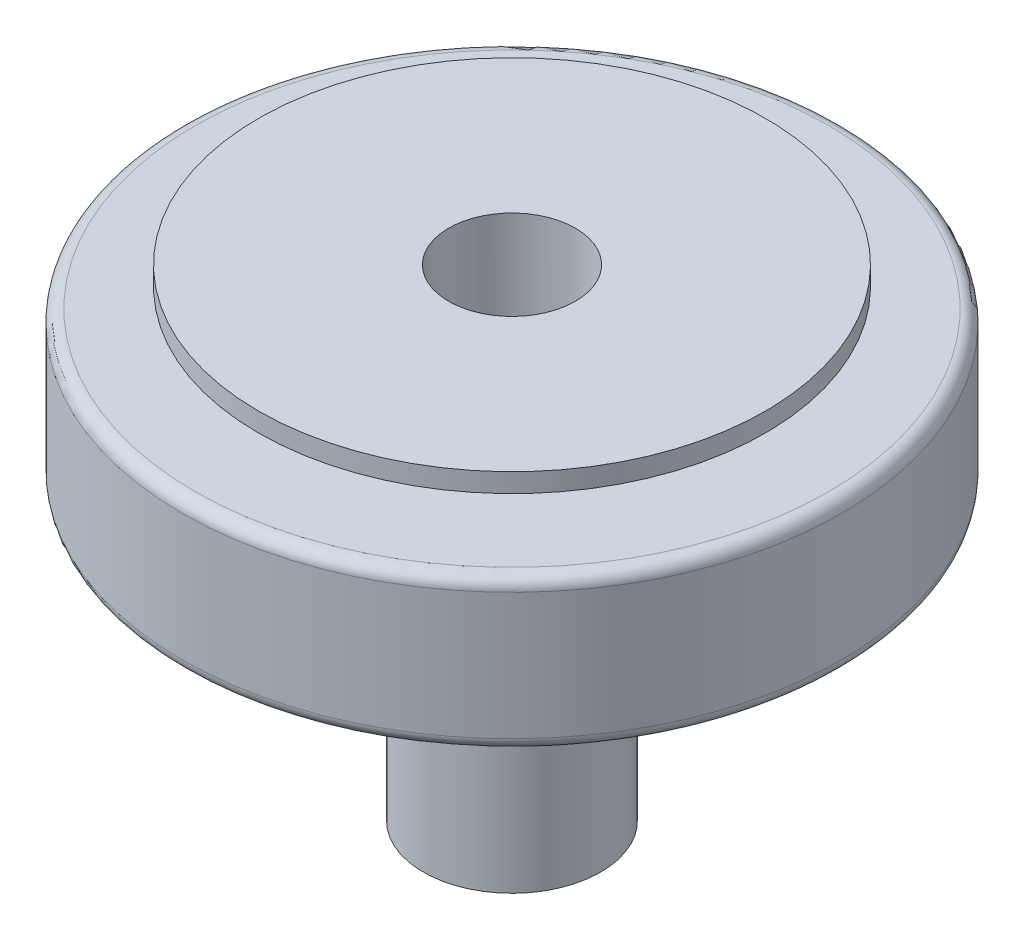
ISO-10303-21;
HEADER;
FILE_DESCRIPTION(('STEP AP214'),'2;1');
FILE_NAME('part.step','',(''),(''),'','','');
FILE_SCHEMA(('AUTOMOTIVE_DESIGN { 1 0 10303 214 1 1 1 1 }'));
ENDSEC;
DATA;
#1=APPLICATION_CONTEXT('core data for automotive mechanical design processes');
#2=APPLICATION_PROTOCOL_DEFINITION('international standard','automotive_design',2000,#1);
#3=PRODUCT_CONTEXT('',#1,'mechanical');
#4=PRODUCT('Part','Part','',(#3));
#5=PRODUCT_RELATED_PRODUCT_CATEGORY('part','',(#4));
#6=PRODUCT_DEFINITION_FORMATION('','',#4);
#7=PRODUCT_DEFINITION_CONTEXT('part definition',#1,'design');
#8=PRODUCT_DEFINITION('design','',#6,#7);
#9=PRODUCT_DEFINITION_SHAPE('','',#8);
#10=(LENGTH_UNIT() NAMED_UNIT(*) SI_UNIT(.MILLI.,.METRE.));
#11=(NAMED_UNIT(*) PLANE_ANGLE_UNIT() SI_UNIT($,.RADIAN.));
#12=(NAMED_UNIT(*) SI_UNIT($,.STERADIAN.) SOLID_ANGLE_UNIT());
#13=UNCERTAINTY_MEASURE_WITH_UNIT(LENGTH_MEASURE(1.E-05),#10,'distance_accuracy_value','');
#14=(GEOMETRIC_REPRESENTATION_CONTEXT(3) GLOBAL_UNCERTAINTY_ASSIGNED_CONTEXT((#13)) GLOBAL_UNIT_ASSIGNED_CONTEXT((#10,
#11,#12)) REPRESENTATION_CONTEXT('',''));
#15=CARTESIAN_POINT('',(0.,0.,0.));
#16=DIRECTION('',(0.,0.,1.));
#17=DIRECTION('',(1.,0.,0.));
#18=AXIS2_PLACEMENT_3D('',#15,#16,#17);
#19=CARTESIAN_POINT('',(0.,1.,0.));
#20=DIRECTION('',(0.,1.,0.));
#21=DIRECTION('',(0.,0.,1.));
#22=AXIS2_PLACEMENT_3D('',#19,#20,#21);
#23=TOROIDAL_SURFACE('',#22,25.,1.);
#24=CARTESIAN_POINT('',(0.,1.,0.));
#25=DIRECTION('',(0.,1.,0.));
#26=DIRECTION('',(0.,0.,1.));
#27=AXIS2_PLACEMENT_3D('',#24,#25,#26);
#28=CIRCLE('',#27,26.);
#29=CARTESIAN_POINT('',(0.,1.,26.));
#30=VERTEX_POINT('',#29);
#31=EDGE_CURVE('E50',#30,#30,#28,.T.);
#32=ORIENTED_EDGE('',*,*,#31,.F.);
#33=EDGE_LOOP('',(#32));
#34=FACE_BOUND('',#33,.T.);
#35=CARTESIAN_POINT('',(0.,0.,0.));
#36=DIRECTION('',(0.,1.,0.));
#37=DIRECTION('',(0.,0.,1.));
#38=AXIS2_PLACEMENT_3D('',#35,#36,#37);
#39=CIRCLE('',#38,25.);
#40=CARTESIAN_POINT('',(0.,0.,25.));
#41=VERTEX_POINT('',#40);
#42=EDGE_CURVE('E10',#41,#41,#39,.F.);
#43=ORIENTED_EDGE('',*,*,#42,.F.);
#44=EDGE_LOOP('',(#43));
#45=FACE_BOUND('',#44,.T.);
#46=ADVANCED_FACE('F43',(#34,#45),#23,.T.);
#47=CARTESIAN_POINT('',(0.,11.,0.));
#48=DIRECTION('',(0.,1.,0.));
#49=DIRECTION('',(0.,0.,1.));
#50=AXIS2_PLACEMENT_3D('',#47,#48,#49);
#51=TOROIDAL_SURFACE('',#50,25.,1.);
#52=CARTESIAN_POINT('',(0.,11.,0.));
#53=DIRECTION('',(0.,1.,0.));
#54=DIRECTION('',(0.,0.,1.));
#55=AXIS2_PLACEMENT_3D('',#52,#53,#54);
#56=CIRCLE('',#55,26.);
#57=CARTESIAN_POINT('',(0.,11.,26.));
#58=VERTEX_POINT('',#57);
#59=EDGE_CURVE('E60',#58,#58,#56,.F.);
#60=ORIENTED_EDGE('',*,*,#59,.F.);
#61=EDGE_LOOP('',(#60));
#62=FACE_BOUND('',#61,.T.);
#63=CARTESIAN_POINT('',(0.,12.,0.));
#64=DIRECTION('',(0.,1.,0.));
#65=DIRECTION('',(0.,0.,1.));
#66=AXIS2_PLACEMENT_3D('',#63,#64,#65);
#67=CIRCLE('',#66,25.);
#68=CARTESIAN_POINT('',(0.,12.,25.));
#69=VERTEX_POINT('',#68);
#70=EDGE_CURVE('E55',#69,#69,#67,.T.);
#71=ORIENTED_EDGE('',*,*,#70,.F.);
#72=EDGE_LOOP('',(#71));
#73=FACE_BOUND('',#72,.T.);
#74=ADVANCED_FACE('F118',(#62,#73),#51,.T.);
#75=CARTESIAN_POINT('',(0.,-3.,0.));
#76=DIRECTION('',(0.,-1.,0.));
#77=DIRECTION('',(0.,0.,-1.));
#78=AXIS2_PLACEMENT_3D('',#75,#76,#77);
#79=PLANE('',#78);
#80=CARTESIAN_POINT('',(0.,-3.,0.));
#81=DIRECTION('',(0.,-1.,0.));
#82=DIRECTION('',(0.,0.,-1.));
#83=AXIS2_PLACEMENT_3D('',#80,#81,#82);
#84=CIRCLE('',#83,20.);
#85=CARTESIAN_POINT('',(0.,-3.,-20.));
#86=VERTEX_POINT('',#85);
#87=EDGE_CURVE('E187',#86,#86,#84,.T.);
#88=ORIENTED_EDGE('',*,*,#87,.T.);
#89=EDGE_LOOP('',(#88));
#90=FACE_BOUND('',#89,.T.);
#91=CARTESIAN_POINT('',(0.,-3.,0.));
#92=DIRECTION('',(0.,-1.,0.));
#93=DIRECTION('',(0.,0.,-1.));
#94=AXIS2_PLACEMENT_3D('',#91,#92,#93);
#95=CIRCLE('',#94,7.);
#96=CARTESIAN_POINT('',(0.,-3.,-7.));
#97=VERTEX_POINT('',#96);
#98=EDGE_CURVE('E203',#97,#97,#95,.T.);
#99=ORIENTED_EDGE('',*,*,#98,.F.);
#100=EDGE_LOOP('',(#99));
#101=FACE_BOUND('',#100,.T.);
#102=ADVANCED_FACE('F113',(#90,#101),#79,.T.);
#103=CARTESIAN_POINT('',(0.,12.,0.));
#104=DIRECTION('',(0.,-1.,0.));
#105=DIRECTION('',(0.,0.,-1.));
#106=AXIS2_PLACEMENT_3D('',#103,#104,#105);
#107=CYLINDRICAL_SURFACE('',#106,26.);
#108=ORIENTED_EDGE('',*,*,#31,.T.);
#109=EDGE_LOOP('',(#108));
#110=FACE_BOUND('',#109,.T.);
#111=ORIENTED_EDGE('',*,*,#59,.T.);
#112=EDGE_LOOP('',(#111));
#113=FACE_BOUND('',#112,.T.);
#114=ADVANCED_FACE('F117',(#110,#113),#107,.T.);
#115=CARTESIAN_POINT('',(0.,12.,0.));
#116=DIRECTION('',(0.,1.,0.));
#117=DIRECTION('',(0.,0.,1.));
#118=AXIS2_PLACEMENT_3D('',#115,#116,#117);
#119=PLANE('',#118);
#120=ORIENTED_EDGE('',*,*,#70,.T.);
#121=EDGE_LOOP('',(#120));
#122=FACE_BOUND('',#121,.T.);
#123=CARTESIAN_POINT('',(0.,12.,0.));
#124=DIRECTION('',(0.,1.,0.));
#125=DIRECTION('',(0.,0.,1.));
#126=AXIS2_PLACEMENT_3D('',#123,#124,#125);
#127=CIRCLE('',#126,17.5);
#128=CARTESIAN_POINT('',(0.,12.,17.5));
#129=VERTEX_POINT('',#128);
#130=EDGE_CURVE('E167',#129,#129,#127,.T.);
#131=ORIENTED_EDGE('',*,*,#130,.F.);
#132=EDGE_LOOP('',(#131));
#133=FACE_BOUND('',#132,.T.);
#134=ADVANCED_FACE('F148',(#122,#133),#119,.T.);
#135=CARTESIAN_POINT('',(0.,0.,0.));
#136=DIRECTION('',(0.,1.,0.));
#137=DIRECTION('',(0.,0.,1.));
#138=AXIS2_PLACEMENT_3D('',#135,#136,#137);
#139=PLANE('',#138);
#140=ORIENTED_EDGE('',*,*,#42,.T.);
#141=EDGE_LOOP('',(#140));
#142=FACE_BOUND('',#141,.T.);
#143=CARTESIAN_POINT('',(0.,0.,0.));
#144=DIRECTION('',(0.,-1.,0.));
#145=DIRECTION('',(0.,0.,-1.));
#146=AXIS2_PLACEMENT_3D('',#143,#144,#145);
#147=CIRCLE('',#146,17.5);
#148=CARTESIAN_POINT('',(0.,0.,-17.5));
#149=VERTEX_POINT('',#148);
#150=EDGE_CURVE('E66',#149,#149,#147,.T.);
#151=ORIENTED_EDGE('',*,*,#150,.F.);
#152=EDGE_LOOP('',(#151));
#153=FACE_BOUND('',#152,.T.);
#154=ADVANCED_FACE('F146',(#142,#153),#139,.F.);
#155=CARTESIAN_POINT('',(0.,13.5,0.));
#156=DIRECTION('',(0.,-1.,0.));
#157=DIRECTION('',(0.,0.,-1.));
#158=AXIS2_PLACEMENT_3D('',#155,#156,#157);
#159=CYLINDRICAL_SURFACE('',#158,17.5);
#160=CARTESIAN_POINT('',(0.,13.5,0.));
#161=DIRECTION('',(0.,1.,0.));
#162=DIRECTION('',(0.,0.,1.));
#163=AXIS2_PLACEMENT_3D('',#160,#161,#162);
#164=CIRCLE('',#163,17.5);
#165=CARTESIAN_POINT('',(0.,13.5,17.5));
#166=VERTEX_POINT('',#165);
#167=EDGE_CURVE('E170',#166,#166,#164,.T.);
#168=ORIENTED_EDGE('',*,*,#167,.F.);
#169=EDGE_LOOP('',(#168));
#170=FACE_BOUND('',#169,.T.);
#171=ORIENTED_EDGE('',*,*,#130,.T.);
#172=EDGE_LOOP('',(#171));
#173=FACE_BOUND('',#172,.T.);
#174=ADVANCED_FACE('F142',(#170,#173),#159,.T.);
#175=CARTESIAN_POINT('',(0.,-1.5,0.));
#176=DIRECTION('',(0.,1.,0.));
#177=DIRECTION('',(0.,0.,1.));
#178=AXIS2_PLACEMENT_3D('',#175,#176,#177);
#179=CYLINDRICAL_SURFACE('',#178,17.5);
#180=CARTESIAN_POINT('',(0.,-1.5,0.));
#181=DIRECTION('',(0.,-1.,0.));
#182=DIRECTION('',(0.,0.,-1.));
#183=AXIS2_PLACEMENT_3D('',#180,#181,#182);
#184=CIRCLE('',#183,17.5);
#185=CARTESIAN_POINT('',(0.,-1.5,-17.5));
#186=VERTEX_POINT('',#185);
#187=EDGE_CURVE('E176',#186,#186,#184,.T.);
#188=ORIENTED_EDGE('',*,*,#187,.F.);
#189=EDGE_LOOP('',(#188));
#190=FACE_BOUND('',#189,.T.);
#191=ORIENTED_EDGE('',*,*,#150,.T.);
#192=EDGE_LOOP('',(#191));
#193=FACE_BOUND('',#192,.T.);
#194=ADVANCED_FACE('F138',(#190,#193),#179,.T.);
#195=CARTESIAN_POINT('',(0.,15.,0.));
#196=DIRECTION('',(0.,-1.,0.));
#197=DIRECTION('',(0.,0.,-1.));
#198=AXIS2_PLACEMENT_3D('',#195,#196,#197);
#199=CYLINDRICAL_SURFACE('',#198,20.);
#200=CARTESIAN_POINT('',(0.,15.,0.));
#201=DIRECTION('',(0.,1.,0.));
#202=DIRECTION('',(0.,0.,1.));
#203=AXIS2_PLACEMENT_3D('',#200,#201,#202);
#204=CIRCLE('',#203,20.);
#205=CARTESIAN_POINT('',(0.,15.,20.));
#206=VERTEX_POINT('',#205);
#207=EDGE_CURVE('E182',#206,#206,#204,.T.);
#208=ORIENTED_EDGE('',*,*,#207,.F.);
#209=EDGE_LOOP('',(#208));
#210=FACE_BOUND('',#209,.T.);
#211=CARTESIAN_POINT('',(0.,13.5,0.));
#212=DIRECTION('',(0.,1.,0.));
#213=DIRECTION('',(0.,0.,1.));
#214=AXIS2_PLACEMENT_3D('',#211,#212,#213);
#215=CIRCLE('',#214,20.);
#216=CARTESIAN_POINT('',(0.,13.5,20.));
#217=VERTEX_POINT('',#216);
#218=EDGE_CURVE('E183',#217,#217,#215,.T.);
#219=ORIENTED_EDGE('',*,*,#218,.T.);
#220=EDGE_LOOP('',(#219));
#221=FACE_BOUND('',#220,.T.);
#222=ADVANCED_FACE('F131',(#210,#221),#199,.T.);
#223=CARTESIAN_POINT('',(0.,15.,0.));
#224=DIRECTION('',(0.,1.,0.));
#225=DIRECTION('',(0.,0.,1.));
#226=AXIS2_PLACEMENT_3D('',#223,#224,#225);
#227=PLANE('',#226);
#228=CARTESIAN_POINT('',(0.,15.,0.));
#229=DIRECTION('',(0.,-1.,0.));
#230=DIRECTION('',(0.,0.,-1.));
#231=AXIS2_PLACEMENT_3D('',#228,#229,#230);
#232=CIRCLE('',#231,5.);
#233=CARTESIAN_POINT('',(0.,15.,-5.));
#234=VERTEX_POINT('',#233);
#235=EDGE_CURVE('E195',#234,#234,#232,.T.);
#236=ORIENTED_EDGE('',*,*,#235,.T.);
#237=EDGE_LOOP('',(#236));
#238=FACE_BOUND('',#237,.T.);
#239=ORIENTED_EDGE('',*,*,#207,.T.);
#240=EDGE_LOOP('',(#239));
#241=FACE_BOUND('',#240,.T.);
#242=ADVANCED_FACE('F128',(#238,#241),#227,.T.);
#243=CARTESIAN_POINT('',(0.,13.5,0.));
#244=DIRECTION('',(0.,1.,0.));
#245=DIRECTION('',(0.,0.,1.));
#246=AXIS2_PLACEMENT_3D('',#243,#244,#245);
#247=PLANE('',#246);
#248=ORIENTED_EDGE('',*,*,#167,.T.);
#249=EDGE_LOOP('',(#248));
#250=FACE_BOUND('',#249,.T.);
#251=ORIENTED_EDGE('',*,*,#218,.F.);
#252=EDGE_LOOP('',(#251));
#253=FACE_BOUND('',#252,.T.);
#254=ADVANCED_FACE('F126',(#250,#253),#247,.F.);
#255=CARTESIAN_POINT('',(0.,-3.,0.));
#256=DIRECTION('',(0.,1.,0.));
#257=DIRECTION('',(0.,0.,1.));
#258=AXIS2_PLACEMENT_3D('',#255,#256,#257);
#259=CYLINDRICAL_SURFACE('',#258,20.);
#260=ORIENTED_EDGE('',*,*,#87,.F.);
#261=EDGE_LOOP('',(#260));
#262=FACE_BOUND('',#261,.T.);
#263=CARTESIAN_POINT('',(0.,-1.5,0.));
#264=DIRECTION('',(0.,-1.,0.));
#265=DIRECTION('',(0.,0.,-1.));
#266=AXIS2_PLACEMENT_3D('',#263,#264,#265);
#267=CIRCLE('',#266,20.);
#268=CARTESIAN_POINT('',(0.,-1.5,-20.));
#269=VERTEX_POINT('',#268);
#270=EDGE_CURVE('E191',#269,#269,#267,.T.);
#271=ORIENTED_EDGE('',*,*,#270,.T.);
#272=EDGE_LOOP('',(#271));
#273=FACE_BOUND('',#272,.T.);
#274=ADVANCED_FACE('F122',(#262,#273),#259,.T.);
#275=CARTESIAN_POINT('',(0.,-1.5,0.));
#276=DIRECTION('',(0.,-1.,0.));
#277=DIRECTION('',(0.,0.,-1.));
#278=AXIS2_PLACEMENT_3D('',#275,#276,#277);
#279=PLANE('',#278);
#280=ORIENTED_EDGE('',*,*,#187,.T.);
#281=EDGE_LOOP('',(#280));
#282=FACE_BOUND('',#281,.T.);
#283=ORIENTED_EDGE('',*,*,#270,.F.);
#284=EDGE_LOOP('',(#283));
#285=FACE_BOUND('',#284,.T.);
#286=ADVANCED_FACE('F111',(#282,#285),#279,.F.);
#287=CARTESIAN_POINT('',(0.,15.,0.));
#288=DIRECTION('',(0.,-1.,0.));
#289=DIRECTION('',(0.,0.,-1.));
#290=AXIS2_PLACEMENT_3D('',#287,#288,#289);
#291=CYLINDRICAL_SURFACE('',#290,5.);
#292=CARTESIAN_POINT('',(0.,-11.,-5.));
#293=CARTESIAN_POINT('',(0.107493005442891,-11.0000098518237,-4.99999271227085));
#294=CARTESIAN_POINT('',(0.215172564090673,-11.0087177520884,-4.99649294306932));
#295=CARTESIAN_POINT('',(0.427496480417896,-11.0432477035212,-4.98283453100641));
#296=CARTESIAN_POINT('',(0.532131777561248,-11.0691162790861,-4.97265778698877));
#297=CARTESIAN_POINT('',(0.734953922727403,-11.1368760780588,-4.94674209213118));
#298=CARTESIAN_POINT('',(0.833160661616959,-11.1787148462167,-4.93102136364072));
#299=CARTESIAN_POINT('',(1.02107197032837,-11.2770191733265,-4.89556610796078));
#300=CARTESIAN_POINT('',(1.11077947675099,-11.3334796549189,-4.87583297458057));
#301=CARTESIAN_POINT('',(1.28350100757039,-11.4622354985609,-4.83330886170419));
#302=CARTESIAN_POINT('',(1.36606227255021,-11.5351066562403,-4.8104229692919));
#303=CARTESIAN_POINT('',(1.51817500478472,-11.6934000034768,-4.76460576906194));
#304=CARTESIAN_POINT('',(1.58772010713353,-11.7788282972117,-4.74167444453792));
#305=CARTESIAN_POINT('',(1.71487456729288,-11.9644280702423,-4.69722791797136));
#306=CARTESIAN_POINT('',(1.77181498119547,-12.0650864860232,-4.67582115964951));
#307=CARTESIAN_POINT('',(1.86775471903715,-12.27553639842,-4.63833647186792));
#308=CARTESIAN_POINT('',(1.90676256428584,-12.3853235278484,-4.62225601244176));
#309=CARTESIAN_POINT('',(1.96389882339587,-12.6057123335921,-4.59826357660818));
#310=CARTESIAN_POINT('',(1.98289396580565,-12.7160512355762,-4.59001420355605));
#311=CARTESIAN_POINT('',(2.00217296164003,-12.9386349983073,-4.58164004049144));
#312=CARTESIAN_POINT('',(2.00246601631322,-13.050878894625,-4.58151125522768));
#313=CARTESIAN_POINT('',(1.98498936750454,-13.265756671458,-4.58910500279994));
#314=CARTESIAN_POINT('',(1.96847531430514,-13.368515714409,-4.5962817503845));
#315=CARTESIAN_POINT('',(1.91994688029782,-13.5696595560067,-4.61676187607836));
#316=CARTESIAN_POINT('',(1.88792979480463,-13.6680435881103,-4.63006632321673));
#317=CARTESIAN_POINT('',(1.80869473255107,-13.860017836196,-4.6615948508853));
#318=CARTESIAN_POINT('',(1.76117986231532,-13.9534692390547,-4.67991379280788));
#319=CARTESIAN_POINT('',(1.65250646073221,-14.1314158163616,-4.7193811638989));
#320=CARTESIAN_POINT('',(1.59134280510084,-14.2159076094028,-4.74053065456849));
#321=CARTESIAN_POINT('',(1.45155059945443,-14.380409728802,-4.78526736742271));
#322=CARTESIAN_POINT('',(1.37193746297063,-14.459568729446,-4.80891664976152));
#323=CARTESIAN_POINT('',(1.20031442743019,-14.603684478002,-4.85459824958282));
#324=CARTESIAN_POINT('',(1.10830206533443,-14.6686383974103,-4.87663024445325));
#325=CARTESIAN_POINT('',(0.912077652605843,-14.7836174474158,-4.91714681264548));
#326=CARTESIAN_POINT('',(0.807660491346477,-14.8333222811971,-4.93555270095415));
#327=CARTESIAN_POINT('',(0.591023765482881,-14.9141678610781,-4.96614828328759));
#328=CARTESIAN_POINT('',(0.478808196849672,-14.9453180375574,-4.97834113462382));
#329=CARTESIAN_POINT('',(0.256895887607819,-14.9864482954197,-4.99456139506911));
#330=CARTESIAN_POINT('',(0.147443293985533,-14.9975724542536,-4.99902945833514));
#331=CARTESIAN_POINT('',(-0.0718453098078183,-15.0017131005286,-5.00068478510631));
#332=CARTESIAN_POINT('',(-0.181681213223925,-14.9947342815475,-4.99787393582291));
#333=CARTESIAN_POINT('',(-0.393432739121989,-14.963708247448,-4.98557567063753));
#334=CARTESIAN_POINT('',(-0.495482491775476,-14.940442019649,-4.97639391345523));
#335=CARTESIAN_POINT('',(-0.694135428060782,-14.8785642916902,-4.952594414055));
#336=CARTESIAN_POINT('',(-0.790737910224846,-14.8399508203313,-4.9379759735653));
#337=CARTESIAN_POINT('',(-0.979078785816704,-14.7472150603201,-4.90416594770812));
#338=CARTESIAN_POINT('',(-1.07057802275541,-14.6926545279569,-4.88484815979803));
#339=CARTESIAN_POINT('',(-1.24344359124656,-14.5700596760944,-4.84373364745525));
#340=CARTESIAN_POINT('',(-1.32480584076113,-14.5020199570774,-4.8219359311027));
#341=CARTESIAN_POINT('',(-1.48072304302882,-14.3491299870504,-4.77645117638112));
#342=CARTESIAN_POINT('',(-1.55447393380607,-14.2634664584938,-4.75273441425052));
#343=CARTESIAN_POINT('',(-1.68675119741371,-14.0805599169906,-4.70741672917132));
#344=CARTESIAN_POINT('',(-1.74527506133751,-13.98331499966,-4.68581615526511));
#345=CARTESIAN_POINT('',(-1.84580750193163,-13.7785383054059,-4.64714299907708));
#346=CARTESIAN_POINT('',(-1.88765059453446,-13.6709160007877,-4.63011630884788));
#347=CARTESIAN_POINT('',(-1.95229621970531,-13.4492663482848,-4.60323673477931));
#348=CARTESIAN_POINT('',(-1.97511280526932,-13.3352437941876,-4.59337855695998));
#349=CARTESIAN_POINT('',(-1.9997156172784,-13.1128720982255,-4.58271759299926));
#350=CARTESIAN_POINT('',(-2.00289708230287,-13.0047051604066,-4.58131421008171));
#351=CARTESIAN_POINT('',(-1.99180315927752,-12.7894551422867,-4.58614836033098));
#352=CARTESIAN_POINT('',(-1.97752998791378,-12.6823719260974,-4.59238492324793));
#353=CARTESIAN_POINT('',(-1.93307136615365,-12.476667810145,-4.61126649079021));
#354=CARTESIAN_POINT('',(-1.90353749357098,-12.377879725567,-4.62364831827449));
#355=CARTESIAN_POINT('',(-1.83000544849101,-12.1866213703865,-4.65324001232696));
#356=CARTESIAN_POINT('',(-1.78600328139381,-12.0941528531002,-4.67045121206007));
#357=CARTESIAN_POINT('',(-1.68187276275973,-11.9123903807292,-4.70898609604491));
#358=CARTESIAN_POINT('',(-1.62096533515949,-11.8235813298695,-4.73048882313242));
#359=CARTESIAN_POINT('',(-1.4858921192715,-11.6570066827962,-4.77463804372237));
#360=CARTESIAN_POINT('',(-1.41172233481812,-11.5792444278717,-4.79728488048406));
#361=CARTESIAN_POINT('',(-1.24650550627246,-11.4317971467364,-4.84293567087394));
#362=CARTESIAN_POINT('',(-1.15467600114614,-11.3629626931019,-4.86586757962185));
#363=CARTESIAN_POINT('',(-0.959900320285778,-11.2416629573784,-4.90800406713717));
#364=CARTESIAN_POINT('',(-0.856949004547236,-11.1892052878475,-4.92720691092906));
#365=CARTESIAN_POINT('',(-0.644738062495201,-11.1033777848097,-4.95939714815861));
#366=CARTESIAN_POINT('',(-0.535631618219693,-11.0696706764397,-4.97249363055028));
#367=CARTESIAN_POINT('',(-0.312876546281218,-11.0213608790457,-4.99144306209366));
#368=CARTESIAN_POINT('',(-0.19924352585891,-11.0066975632561,-4.99731899495638));
#369=CARTESIAN_POINT('',(-0.0569122978909282,-11.0006046190217,-4.99975899504136));
#370=CARTESIAN_POINT('',(-0.0284626887407577,-10.9999973913708,-5.00000192969176));
#371=CARTESIAN_POINT('',(0.,-11.,-5.));
#372=B_SPLINE_CURVE_WITH_KNOTS('',3,(#292,#293,#294,#295,#296,#297,#298,#299,#300,#301,#302,
#303,#304,#305,#306,#307,#308,#309,#310,#311,#312,#313,#314,#315,#316,#317,#318,#319,#320,#321,
#322,#323,#324,#325,#326,#327,#328,#329,#330,#331,#332,#333,#334,#335,#336,#337,#338,#339,#340,
#341,#342,#343,#344,#345,#346,#347,#348,#349,#350,#351,#352,#353,#354,#355,#356,#357,#358,#359,
#360,#361,#362,#363,#364,#365,#366,#367,#368,#369,#370,#371),.UNSPECIFIED.,.T.,.F.,(4,2,2,2,2,2,
2,2,2,2,2,2,2,2,2,2,2,2,2,2,2,2,2,2,2,2,2,2,2,2,2,2,2,2,2,2,2,2,2,4),(0.,0.322402987893071,
0.645683636007935,0.967911457471581,1.29002753567984,1.62597381700397,1.96208394934411,
2.31315258819217,2.66405423118268,2.99904105308829,3.33386306340488,3.64538328401372,
3.95695787256048,4.27489126298816,4.59294421938183,4.93558349186557,5.27829092839733,
5.62776913162806,5.97706956113791,6.30569184528008,6.63422893570082,6.94800455564366,
7.26182048993797,7.58523513398263,7.90877959498969,8.25368474624414,8.59864669043748,
8.94695045140828,9.29499672645934,9.61799673392748,9.94095572563046,10.2511431854877,
10.5614163580516,10.8894546805669,11.2175920134839,11.5670042353384,11.9165786364053,
12.2596430101332,12.6016125240434,12.686980458968),.UNSPECIFIED.);
#373=CARTESIAN_POINT('',(0.,-11.,-5.));
#374=VERTEX_POINT('',#373);
#375=EDGE_CURVE('E76',#374,#374,#372,.T.);
#376=ORIENTED_EDGE('',*,*,#375,.T.);
#377=EDGE_LOOP('',(#376));
#378=FACE_BOUND('',#377,.T.);
#379=CARTESIAN_POINT('',(-4.58257569495584,-13.,-2.));
#380=CARTESIAN_POINT('',(-4.58258022779737,-13.107123689713,-1.99999540068022));
#381=CARTESIAN_POINT('',(-4.58638433797122,-13.2144262943318,-1.99134173553407));
#382=CARTESIAN_POINT('',(-4.601110833066,-13.4259390840996,-1.95706710874823));
#383=CARTESIAN_POINT('',(-4.61205140628347,-13.5301406543385,-1.93140279032341));
#384=CARTESIAN_POINT('',(-4.63960410719222,-13.7320518089708,-1.86423554476216));
#385=CARTESIAN_POINT('',(-4.65619484260882,-13.8297842432912,-1.82279228998551));
#386=CARTESIAN_POINT('',(-4.69314677188873,-14.0168853548623,-1.72542013194152));
#387=CARTESIAN_POINT('',(-4.71350714220611,-14.1062558525241,-1.66949439157707));
#388=CARTESIAN_POINT('',(-4.75700861562336,-14.2792603145443,-1.54132201423254));
#389=CARTESIAN_POINT('',(-4.78023917022606,-14.3623563993972,-1.46837936836551));
#390=CARTESIAN_POINT('',(-4.82612457915278,-14.5155290208558,-1.30970909513215));
#391=CARTESIAN_POINT('',(-4.84877922991761,-14.5856010077097,-1.22397701877347));
#392=CARTESIAN_POINT('',(-4.89203407641395,-14.7134063903097,-1.03800631337303));
#393=CARTESIAN_POINT('',(-4.9125180361257,-14.7705442996859,-0.937328966419092));
#394=CARTESIAN_POINT('',(-4.94803927702516,-14.8668435701738,-0.726825322068637));
#395=CARTESIAN_POINT('',(-4.96307877403249,-14.9060122462489,-0.617002769076882));
#396=CARTESIAN_POINT('',(-4.98538324990609,-14.9633414859931,-0.396966427039753));
#397=CARTESIAN_POINT('',(-4.99298936770628,-14.9824273139702,-0.287028984858316));
#398=CARTESIAN_POINT('',(-5.00080310687431,-15.0020284857814,-0.065266328583962));
#399=CARTESIAN_POINT('',(-5.00101348770556,-15.0025507559658,0.0465581658394113));
#400=CARTESIAN_POINT('',(-4.99421962820612,-14.9855172301958,0.262232494702089));
#401=CARTESIAN_POINT('',(-4.98761996771485,-14.9689752272453,0.366177452870457));
#402=CARTESIAN_POINT('',(-4.96849291469141,-14.920007123697,0.569673109221914));
#403=CARTESIAN_POINT('',(-4.95596508721342,-14.8875798576015,0.669223484391239));
#404=CARTESIAN_POINT('',(-4.92596824457467,-14.8073635171217,0.862897938510558));
#405=CARTESIAN_POINT('',(-4.90842760466223,-14.7593502851846,0.956917623378895));
#406=CARTESIAN_POINT('',(-4.87014585180275,-14.6495349930808,1.13580815074131));
#407=CARTESIAN_POINT('',(-4.84940364267149,-14.5877282068998,1.22067584271796));
#408=CARTESIAN_POINT('',(-4.80521637176122,-14.4473508640561,1.38476882799018));
#409=CARTESIAN_POINT('',(-4.78168326511759,-14.3679461074272,1.46325784526632));
#410=CARTESIAN_POINT('',(-4.73561660973263,-14.197009428168,1.60610741539265));
#411=CARTESIAN_POINT('',(-4.71308339008076,-14.1054735518044,1.67046334378698));
#412=CARTESIAN_POINT('',(-4.67096897409023,-13.9095809776261,1.78490418871927));
#413=CARTESIAN_POINT('',(-4.65148914057708,-13.8049351696614,1.83453465163626));
#414=CARTESIAN_POINT('',(-4.61887590344084,-13.5877845096878,1.91517625986646));
#415=CARTESIAN_POINT('',(-4.60573837891311,-13.4752848152734,1.94619949837798));
#416=CARTESIAN_POINT('',(-4.58829759702716,-13.2529642225326,1.9869549488549));
#417=CARTESIAN_POINT('',(-4.58350366456138,-13.1433995528714,1.99787209681454));
#418=CARTESIAN_POINT('',(-4.58189497869038,-12.9239227922404,2.00156132644289));
#419=CARTESIAN_POINT('',(-4.58507780560362,-12.8140108167243,1.99433891059128));
#420=CARTESIAN_POINT('',(-4.59856044359114,-12.6035410650431,1.96303289479003));
#421=CARTESIAN_POINT('',(-4.60844457798302,-12.5028070625999,1.93993306202386));
#422=CARTESIAN_POINT('',(-4.6337005102734,-12.3067115952145,1.87880418691087));
#423=CARTESIAN_POINT('',(-4.64907352488598,-12.2113513268928,1.84077183430228));
#424=CARTESIAN_POINT('',(-4.68433781860101,-12.0243976422043,1.74913563948157));
#425=CARTESIAN_POINT('',(-4.70438704639177,-11.9331138113055,1.69496286826465));
#426=CARTESIAN_POINT('',(-4.74650385157795,-11.7605170125584,1.57316522444182));
#427=CARTESIAN_POINT('',(-4.76857224896045,-11.6792081272046,1.50553487348189));
#428=CARTESIAN_POINT('',(-4.81420915971416,-11.5226265914006,1.35284421168058));
#429=CARTESIAN_POINT('',(-4.83776807285233,-11.4482434347084,1.26686542944544));
#430=CARTESIAN_POINT('',(-4.88219794567532,-11.3148229233902,1.08308363336851));
#431=CARTESIAN_POINT('',(-4.90306879593135,-11.2557861934049,0.985280138466609));
#432=CARTESIAN_POINT('',(-4.9398371590039,-11.1549523735367,0.780279934003014));
#433=CARTESIAN_POINT('',(-4.9557358624066,-11.1131511558263,0.673085480998744));
#434=CARTESIAN_POINT('',(-4.98072713468904,-11.0484511476002,0.452393590914546));
#435=CARTESIAN_POINT('',(-4.98982339706103,-11.0255420985893,0.338899610276818));
#436=CARTESIAN_POINT('',(-4.99979008211858,-11.0004952983472,0.116816510362614));
#437=CARTESIAN_POINT('',(-5.00115846749745,-10.997099871438,0.0083904926520863));
#438=CARTESIAN_POINT('',(-4.99686042373721,-11.0078554793835,-0.207433835792266));
#439=CARTESIAN_POINT('',(-4.99119505948774,-11.0220038581556,-0.314832299614387));
#440=CARTESIAN_POINT('',(-4.97371513381836,-11.0665467879999,-0.522170901733398));
#441=CARTESIAN_POINT('',(-4.96209480698998,-11.0964289447566,-0.622238803864869));
#442=CARTESIAN_POINT('',(-4.93394947767358,-11.1710528058811,-0.815922355542604));
#443=CARTESIAN_POINT('',(-4.91742357062859,-11.2157972509391,-0.909536811189122));
#444=CARTESIAN_POINT('',(-4.88018094611867,-11.3211031933532,-1.09220303880515));
#445=CARTESIAN_POINT('',(-4.859311306872,-11.3822762753251,-1.18087037518738));
#446=CARTESIAN_POINT('',(-4.8158940222708,-11.517788538747,-1.34705404014793));
#447=CARTESIAN_POINT('',(-4.79334568464253,-11.5921331696082,-1.42456572919735));
#448=CARTESIAN_POINT('',(-4.7473776736768,-11.7573151468487,-1.57120121894449));
#449=CARTESIAN_POINT('',(-4.72399047228096,-11.8488885751441,-1.63950871002775));
#450=CARTESIAN_POINT('',(-4.68049656850749,-12.0429424357208,-1.75984762763149));
#451=CARTESIAN_POINT('',(-4.66039025195448,-12.1454241484535,-1.81187714055767));
#452=CARTESIAN_POINT('',(-4.62758914239064,-12.3490361864702,-1.89399048451634));
#453=CARTESIAN_POINT('',(-4.61439096680415,-12.4494616027124,-1.92562535665267));
#454=CARTESIAN_POINT('',(-4.5944582603412,-12.6544890414926,-1.97271990928489));
#455=CARTESIAN_POINT('',(-4.58770572290435,-12.7590785734244,-1.98822466191608));
#456=CARTESIAN_POINT('',(-4.5839176394209,-12.8867782391115,-1.99692202185513));
#457=CARTESIAN_POINT('',(-4.58341531117284,-12.9094014803564,-1.99807530751895));
#458=CARTESIAN_POINT('',(-4.58274384722723,-12.9546804767972,-1.9996148112425));
#459=CARTESIAN_POINT('',(-4.5825747359592,-12.9773362342552,-2.0000009730612));
#460=CARTESIAN_POINT('',(-4.58257569495584,-13.,-2.));
#461=B_SPLINE_CURVE_WITH_KNOTS('',3,(#379,#380,#381,#382,#383,#384,#385,#386,#387,#388,#389,
#390,#391,#392,#393,#394,#395,#396,#397,#398,#399,#400,#401,#402,#403,#404,#405,#406,#407,#408,
#409,#410,#411,#412,#413,#414,#415,#416,#417,#418,#419,#420,#421,#422,#423,#424,#425,#426,#427,
#428,#429,#430,#431,#432,#433,#434,#435,#436,#437,#438,#439,#440,#441,#442,#443,#444,#445,#446,
#447,#448,#449,#450,#451,#452,#453,#454,#455,#456,#457,#458,#459,#460),.UNSPECIFIED.,.T.,.F.,(4,
2,2,2,2,2,2,2,2,2,2,2,2,2,2,2,2,2,2,2,2,2,2,2,2,2,2,2,2,2,2,2,2,2,2,2,2,2,2,2,4),(0.,
0.321277648767654,0.643377335822245,0.96427082329339,1.28509428823861,1.62255618284425,
1.96013574348342,2.31102669091428,2.6617746696948,2.99554182887183,3.32918445305672,
3.64408644830302,3.95901155129059,4.27868300234898,4.59846414940031,4.93924044081356,
5.28012807127127,5.63064458717257,5.98093304800101,6.30982147524421,6.63861014907939,
6.94867248085145,7.25880358651638,7.58151154652701,7.90435114525849,8.25103734246979,
8.59773764852748,8.94435487312812,9.29078375954136,9.61461039755953,9.93838801512602,
10.2522199444335,10.5661097782859,10.8938705113992,11.2217671656421,11.5699625328561,
11.9181988175919,12.2351666081908,12.5512463021924,12.619212852096,12.6871843847255),.UNSPECIFIED.);
#462=CARTESIAN_POINT('',(-4.58257569495584,-13.,-2.));
#463=VERTEX_POINT('',#462);
#464=EDGE_CURVE('E101',#463,#463,#461,.T.);
#465=ORIENTED_EDGE('',*,*,#464,.T.);
#466=EDGE_LOOP('',(#465));
#467=FACE_BOUND('',#466,.T.);
#468=ORIENTED_EDGE('',*,*,#235,.F.);
#469=EDGE_LOOP('',(#468));
#470=FACE_BOUND('',#469,.T.);
#471=CARTESIAN_POINT('',(0.,-23.,0.));
#472=DIRECTION('',(0.,-1.,0.));
#473=DIRECTION('',(0.,0.,-1.));
#474=AXIS2_PLACEMENT_3D('',#471,#472,#473);
#475=CIRCLE('',#474,5.);
#476=CARTESIAN_POINT('',(0.,-23.,-5.));
#477=VERTEX_POINT('',#476);
#478=EDGE_CURVE('E207',#477,#477,#475,.T.);
#479=ORIENTED_EDGE('',*,*,#478,.T.);
#480=EDGE_LOOP('',(#479));
#481=FACE_BOUND('',#480,.T.);
#482=ADVANCED_FACE('F106',(#378,#467,#470,#481),#291,.F.);
#483=CARTESIAN_POINT('',(0.,-23.,0.));
#484=DIRECTION('',(0.,-1.,0.));
#485=DIRECTION('',(0.,0.,-1.));
#486=AXIS2_PLACEMENT_3D('',#483,#484,#485);
#487=PLANE('',#486);
#488=CARTESIAN_POINT('',(0.,-23.,0.));
#489=DIRECTION('',(0.,-1.,0.));
#490=DIRECTION('',(0.,0.,-1.));
#491=AXIS2_PLACEMENT_3D('',#488,#489,#490);
#492=CIRCLE('',#491,7.);
#493=CARTESIAN_POINT('',(0.,-23.,-7.));
#494=VERTEX_POINT('',#493);
#495=EDGE_CURVE('E202',#494,#494,#492,.T.);
#496=ORIENTED_EDGE('',*,*,#495,.T.);
#497=EDGE_LOOP('',(#496));
#498=FACE_BOUND('',#497,.T.);
#499=ORIENTED_EDGE('',*,*,#478,.F.);
#500=EDGE_LOOP('',(#499));
#501=FACE_BOUND('',#500,.T.);
#502=ADVANCED_FACE('F110',(#498,#501),#487,.T.);
#503=CARTESIAN_POINT('',(0.,-23.,0.));
#504=DIRECTION('',(0.,1.,0.));
#505=DIRECTION('',(0.,0.,1.));
#506=AXIS2_PLACEMENT_3D('',#503,#504,#505);
#507=CYLINDRICAL_SURFACE('',#506,7.);
#508=CARTESIAN_POINT('',(2.,-13.,-6.70820393249937));
#509=CARTESIAN_POINT('',(1.99999802046393,-12.8901484621228,-6.70820547009708));
#510=CARTESIAN_POINT('',(1.9909186659955,-12.7802769157455,-6.71093179679208));
#511=CARTESIAN_POINT('',(1.95492363390195,-12.563728761137,-6.72150389207102));
#512=CARTESIAN_POINT('',(1.92800070136334,-12.4570534708994,-6.72935174296489));
#513=CARTESIAN_POINT('',(1.85729343292867,-12.2500627991285,-6.74920709521546));
#514=CARTESIAN_POINT('',(1.81353520651874,-12.1497378481829,-6.76120815257369));
#515=CARTESIAN_POINT('',(1.71048364062938,-11.9578321884456,-6.78800921096146));
#516=CARTESIAN_POINT('',(1.65118845666347,-11.866252519622,-6.80280954425194));
#517=CARTESIAN_POINT('',(1.51692480098199,-11.6918084346852,-6.83401783214154));
#518=CARTESIAN_POINT('',(1.4415892111325,-11.6092321978708,-6.8504575596415));
#519=CARTESIAN_POINT('',(1.27817124546927,-11.4576972166962,-6.88281965512018));
#520=CARTESIAN_POINT('',(1.19008737915963,-11.3887400668772,-6.89874196233652));
#521=CARTESIAN_POINT('',(1.00164603215759,-11.2651713516465,-6.92863332001512));
#522=CARTESIAN_POINT('',(0.901090783761869,-11.210850380249,-6.94256054500866));
#523=CARTESIAN_POINT('',(0.691808475239642,-11.119998225584,-6.96652540485531));
#524=CARTESIAN_POINT('',(0.583083010875174,-11.0834635787597,-6.97656379690866));
#525=CARTESIAN_POINT('',(0.36355857512118,-11.0301655387603,-6.99139519300235));
#526=CARTESIAN_POINT('',(0.252887798129042,-11.0129109782953,-6.99631827011303));
#527=CARTESIAN_POINT('',(0.0301201024219257,-10.9971132661168,-7.00082095659694));
#528=CARTESIAN_POINT('',(-0.0819765395885466,-10.9985665376626,-7.00040158738982));
#529=CARTESIAN_POINT('',(-0.300980195735219,-11.019806374918,-6.99436006763307));
#530=CARTESIAN_POINT('',(-0.407943546108944,-11.039061612638,-6.98888870776051));
#531=CARTESIAN_POINT('',(-0.617052222177616,-11.0944951024644,-6.97353886330137));
#532=CARTESIAN_POINT('',(-0.719197254300508,-11.1306743842621,-6.96366011056224));
#533=CARTESIAN_POINT('',(-0.917073833728922,-11.2193094008118,-6.94039031772111));
#534=CARTESIAN_POINT('',(-1.01272304385077,-11.2719387778083,-6.92696205512133));
#535=CARTESIAN_POINT('',(-1.19400724359048,-11.391844586398,-6.89802768974041));
#536=CARTESIAN_POINT('',(-1.27964003241601,-11.4591242276665,-6.8825211319195));
#537=CARTESIAN_POINT('',(-1.44163264854775,-11.6092057106186,-6.85045683019623));
#538=CARTESIAN_POINT('',(-1.51756157758489,-11.692469433605,-6.83388129369387));
#539=CARTESIAN_POINT('',(-1.65449301574976,-11.870715091846,-6.80202973786992));
#540=CARTESIAN_POINT('',(-1.71549431378261,-11.965697976949,-6.78675382405366));
#541=CARTESIAN_POINT('',(-1.82123335985447,-12.165730884498,-6.75915174814409));
#542=CARTESIAN_POINT('',(-1.86583737788771,-12.2708552250517,-6.74685010938643));
#543=CARTESIAN_POINT('',(-1.9365895149609,-12.4875531635046,-6.72688544387341));
#544=CARTESIAN_POINT('',(-1.9627430040271,-12.5991248746599,-6.71922106753542));
#545=CARTESIAN_POINT('',(-1.99507417199885,-12.8214804243323,-6.70969115196194));
#546=CARTESIAN_POINT('',(-2.00190148157354,-12.932161816933,-6.70763711316669));
#547=CARTESIAN_POINT('',(-1.99718996719665,-13.153088315921,-6.7090415959684));
#548=CARTESIAN_POINT('',(-1.98565343424642,-13.2633334750109,-6.71249942992568));
#549=CARTESIAN_POINT('',(-1.94511781425928,-13.477641228023,-6.72435430053723));
#550=CARTESIAN_POINT('',(-1.9165246218414,-13.5817875860152,-6.73263642965451));
#551=CARTESIAN_POINT('',(-1.84315161866429,-13.7838018719977,-6.75309063930731));
#552=CARTESIAN_POINT('',(-1.79836947226768,-13.8816688916456,-6.7652632811114));
#553=CARTESIAN_POINT('',(-1.69261965121623,-14.0710220752167,-6.79250188009389));
#554=CARTESIAN_POINT('',(-1.63127891729131,-14.1622904442022,-6.80763197381122));
#555=CARTESIAN_POINT('',(-1.49460463684841,-14.3334763734434,-6.83893726549831));
#556=CARTESIAN_POINT('',(-1.41926805768137,-14.4133914670121,-6.85511268947611));
#557=CARTESIAN_POINT('',(-1.25370800996556,-14.5623794182882,-6.88734727436087));
#558=CARTESIAN_POINT('',(-1.16306771024055,-14.6309949714187,-6.90338406046143));
#559=CARTESIAN_POINT('',(-0.971185307057545,-14.7520456813827,-6.93297977045999));
#560=CARTESIAN_POINT('',(-0.869943758098183,-14.8044816839224,-6.94653882385412));
#561=CARTESIAN_POINT('',(-0.660433272956166,-14.8911842870263,-6.96956504846406));
#562=CARTESIAN_POINT('',(-0.552224799899635,-14.9255883895862,-6.97906308127248));
#563=CARTESIAN_POINT('',(-0.331245648549922,-14.9756268019402,-6.99303339623885));
#564=CARTESIAN_POINT('',(-0.218476151585437,-14.9912659401813,-6.99750697123019));
#565=CARTESIAN_POINT('',(0.00417823795903014,-15.0029914339978,-7.00085335003284));
#566=CARTESIAN_POINT('',(0.114025631049958,-14.9997441490828,-6.99991703588995));
#567=CARTESIAN_POINT('',(0.331545172422004,-14.9753617185897,-6.99299069122135));
#568=CARTESIAN_POINT('',(0.439217424617532,-14.954227429618,-6.98700090270593));
#569=CARTESIAN_POINT('',(0.648404133039588,-14.8950686390211,-6.97068801860116));
#570=CARTESIAN_POINT('',(0.749965033435051,-14.857196821056,-6.96040414048174));
#571=CARTESIAN_POINT('',(0.945347202761463,-14.7657738417145,-6.93657094143453));
#572=CARTESIAN_POINT('',(1.03916727058068,-14.7122202529077,-6.92302111501784));
#573=CARTESIAN_POINT('',(1.21943345635391,-14.5891026625752,-6.89358955440188));
#574=CARTESIAN_POINT('',(1.30557732800707,-14.5191099132116,-6.8776504578623));
#575=CARTESIAN_POINT('',(1.46512122231839,-14.3658908745461,-6.84544064986529));
#576=CARTESIAN_POINT('',(1.53851771218981,-14.2826609289152,-6.82916984787116));
#577=CARTESIAN_POINT('',(1.67240846029126,-14.1027030830045,-6.79764037543869));
#578=CARTESIAN_POINT('',(1.73251316723594,-14.0056780524965,-6.78241951768489));
#579=CARTESIAN_POINT('',(1.83547943619619,-13.8024781346854,-6.7552844533164));
#580=CARTESIAN_POINT('',(1.8783506488486,-13.6963084089117,-6.74336839719835));
#581=CARTESIAN_POINT('',(1.94098534012467,-13.4923462997673,-6.72558459556592));
#582=CARTESIAN_POINT('',(1.96305899981724,-13.3953096518975,-6.71912438833989));
#583=CARTESIAN_POINT('',(1.99256607043695,-13.1988538816481,-6.71043369466525));
#584=CARTESIAN_POINT('',(2.00000179183146,-13.0994351377689,-6.70820254070055));
#585=CARTESIAN_POINT('',(2.,-13.,-6.70820393249937));
#586=B_SPLINE_CURVE_WITH_KNOTS('',3,(#508,#509,#510,#511,#512,#513,#514,#515,#516,#517,#518,
#519,#520,#521,#522,#523,#524,#525,#526,#527,#528,#529,#530,#531,#532,#533,#534,#535,#536,#537,
#538,#539,#540,#541,#542,#543,#544,#545,#546,#547,#548,#549,#550,#551,#552,#553,#554,#555,#556,
#557,#558,#559,#560,#561,#562,#563,#564,#565,#566,#567,#568,#569,#570,#571,#572,#573,#574,#575,
#576,#577,#578,#579,#580,#581,#582,#583,#584,#585),.UNSPECIFIED.,.T.,.F.,(4,2,2,2,2,2,2,2,2,2,2,
2,2,2,2,2,2,2,2,2,2,2,2,2,2,2,2,2,2,2,2,2,2,2,2,2,2,2,4),(0.,0.32918834236395,0.658510609618862,
0.987324183736437,1.31617681100735,1.65357167206616,1.99100601238483,2.33471483013846,
2.67835669017706,3.01302901028742,3.34763734552418,3.67257037643421,3.99752317946522,
4.32602903378491,4.65460693184835,4.99471612693,5.3348529062976,5.67770520630006,
6.02045767793012,6.35154363333481,6.68258828698449,7.00605289656512,7.32956419216041,
7.66108006042382,7.99266784620105,8.33545388376657,8.67822200084647,9.01833685298089,
9.35836417076638,9.6864689768406,10.0145580709057,10.3397141238921,10.6649205354322,
10.9997976874537,11.3347674991531,11.6785361242131,12.0221119721565,12.3201328886649,
12.61810676147),.UNSPECIFIED.);
#587=CARTESIAN_POINT('',(2.,-13.,-6.70820393249937));
#588=VERTEX_POINT('',#587);
#589=EDGE_CURVE('E67',#588,#588,#586,.T.);
#590=ORIENTED_EDGE('',*,*,#589,.T.);
#591=EDGE_LOOP('',(#590));
#592=FACE_BOUND('',#591,.T.);
#593=CARTESIAN_POINT('',(-6.70820393249937,-13.,-2.));
#594=CARTESIAN_POINT('',(-6.70820547009708,-12.8901484621228,-1.99999802046393));
#595=CARTESIAN_POINT('',(-6.71093179679208,-12.7802769157455,-1.9909186659955));
#596=CARTESIAN_POINT('',(-6.72150389207102,-12.563728761137,-1.95492363390195));
#597=CARTESIAN_POINT('',(-6.72935174296489,-12.4570534708994,-1.92800070136334));
#598=CARTESIAN_POINT('',(-6.74920709521546,-12.2500627991285,-1.85729343292866));
#599=CARTESIAN_POINT('',(-6.76120815257369,-12.1497378481829,-1.81353520651874));
#600=CARTESIAN_POINT('',(-6.78800921096146,-11.9578321884456,-1.71048364062938));
#601=CARTESIAN_POINT('',(-6.80280954425194,-11.866252519622,-1.65118845666347));
#602=CARTESIAN_POINT('',(-6.83401783214154,-11.6918084346852,-1.51692480098199));
#603=CARTESIAN_POINT('',(-6.8504575596415,-11.6092321978708,-1.4415892111325));
#604=CARTESIAN_POINT('',(-6.88281965512018,-11.4576972166962,-1.27817124546927));
#605=CARTESIAN_POINT('',(-6.89874196233652,-11.3887400668772,-1.19008737915963));
#606=CARTESIAN_POINT('',(-6.92863332001512,-11.2651713516465,-1.00164603215759));
#607=CARTESIAN_POINT('',(-6.94256054500866,-11.210850380249,-0.901090783761867));
#608=CARTESIAN_POINT('',(-6.96652540485531,-11.119998225584,-0.69180847523964));
#609=CARTESIAN_POINT('',(-6.97656379690866,-11.0834635787597,-0.583083010875173));
#610=CARTESIAN_POINT('',(-6.99139519300235,-11.0301655387603,-0.363558575121178));
#611=CARTESIAN_POINT('',(-6.99631827011303,-11.0129109782953,-0.25288779812904));
#612=CARTESIAN_POINT('',(-7.00082095659694,-10.9971132661168,-0.0301201024219239));
#613=CARTESIAN_POINT('',(-7.00040158738982,-10.9985665376626,0.0819765395885482));
#614=CARTESIAN_POINT('',(-6.99436006763307,-11.019806374918,0.30098019573522));
#615=CARTESIAN_POINT('',(-6.98888870776051,-11.039061612638,0.407943546108945));
#616=CARTESIAN_POINT('',(-6.97353886330137,-11.0944951024644,0.617052222177617));
#617=CARTESIAN_POINT('',(-6.96366011056224,-11.1306743842621,0.719197254300508));
#618=CARTESIAN_POINT('',(-6.94039031772111,-11.2193094008118,0.917073833728924));
#619=CARTESIAN_POINT('',(-6.92696205512133,-11.2719387778083,1.01272304385077));
#620=CARTESIAN_POINT('',(-6.89802768974041,-11.391844586398,1.19400724359048));
#621=CARTESIAN_POINT('',(-6.8825211319195,-11.4591242276665,1.27964003241601));
#622=CARTESIAN_POINT('',(-6.85045683019623,-11.6092057106186,1.44163264854775));
#623=CARTESIAN_POINT('',(-6.83388129369387,-11.692469433605,1.51756157758489));
#624=CARTESIAN_POINT('',(-6.80202973786992,-11.870715091846,1.65449301574976));
#625=CARTESIAN_POINT('',(-6.78675382405366,-11.965697976949,1.71549431378261));
#626=CARTESIAN_POINT('',(-6.75915174814409,-12.165730884498,1.82123335985447));
#627=CARTESIAN_POINT('',(-6.74685010938643,-12.2708552250517,1.86583737788771));
#628=CARTESIAN_POINT('',(-6.72688544387341,-12.4875531635046,1.9365895149609));
#629=CARTESIAN_POINT('',(-6.71922106753542,-12.5991248746599,1.9627430040271));
#630=CARTESIAN_POINT('',(-6.70969115196194,-12.8214804243323,1.99507417199885));
#631=CARTESIAN_POINT('',(-6.70763711316669,-12.932161816933,2.00190148157354));
#632=CARTESIAN_POINT('',(-6.7090415959684,-13.153088315921,1.99718996719665));
#633=CARTESIAN_POINT('',(-6.71249942992568,-13.2633334750109,1.98565343424642));
#634=CARTESIAN_POINT('',(-6.72435430053723,-13.477641228023,1.94511781425928));
#635=CARTESIAN_POINT('',(-6.73263642965451,-13.5817875860152,1.9165246218414));
#636=CARTESIAN_POINT('',(-6.75309063930731,-13.7838018719977,1.84315161866429));
#637=CARTESIAN_POINT('',(-6.7652632811114,-13.8816688916456,1.79836947226768));
#638=CARTESIAN_POINT('',(-6.79250188009389,-14.0710220752167,1.69261965121623));
#639=CARTESIAN_POINT('',(-6.80763197381122,-14.1622904442022,1.63127891729131));
#640=CARTESIAN_POINT('',(-6.83893726549831,-14.3334763734434,1.49460463684841));
#641=CARTESIAN_POINT('',(-6.85511268947611,-14.4133914670121,1.41926805768137));
#642=CARTESIAN_POINT('',(-6.88734727436087,-14.5623794182882,1.25370800996555));
#643=CARTESIAN_POINT('',(-6.90338406046143,-14.6309949714187,1.16306771024055));
#644=CARTESIAN_POINT('',(-6.93297977045999,-14.7520456813827,0.971185307057543));
#645=CARTESIAN_POINT('',(-6.94653882385412,-14.8044816839224,0.869943758098182));
#646=CARTESIAN_POINT('',(-6.96956504846406,-14.8911842870263,0.660433272956165));
#647=CARTESIAN_POINT('',(-6.97906308127248,-14.9255883895862,0.552224799899634));
#648=CARTESIAN_POINT('',(-6.99303339623885,-14.9756268019402,0.331245648549922));
#649=CARTESIAN_POINT('',(-6.99750697123019,-14.9912659401813,0.218476151585437));
#650=CARTESIAN_POINT('',(-7.00085335003284,-15.0029914339978,-0.00417823795902933));
#651=CARTESIAN_POINT('',(-6.99991703588995,-14.9997441490828,-0.114025631049957));
#652=CARTESIAN_POINT('',(-6.99299069122135,-14.9753617185897,-0.331545172422004));
#653=CARTESIAN_POINT('',(-6.98700090270593,-14.954227429618,-0.439217424617532));
#654=CARTESIAN_POINT('',(-6.97068801860116,-14.8950686390211,-0.648404133039588));
#655=CARTESIAN_POINT('',(-6.96040414048174,-14.857196821056,-0.74996503343505));
#656=CARTESIAN_POINT('',(-6.93657094143453,-14.7657738417145,-0.945347202761462));
#657=CARTESIAN_POINT('',(-6.92302111501784,-14.7122202529077,-1.03916727058068));
#658=CARTESIAN_POINT('',(-6.89358955440188,-14.5891026625752,-1.21943345635391));
#659=CARTESIAN_POINT('',(-6.8776504578623,-14.5191099132116,-1.30557732800707));
#660=CARTESIAN_POINT('',(-6.84544064986529,-14.3658908745461,-1.46512122231839));
#661=CARTESIAN_POINT('',(-6.82916984787116,-14.2826609289152,-1.53851771218981));
#662=CARTESIAN_POINT('',(-6.79764037543869,-14.1027030830045,-1.67240846029126));
#663=CARTESIAN_POINT('',(-6.78241951768489,-14.0056780524965,-1.73251316723594));
#664=CARTESIAN_POINT('',(-6.7552844533164,-13.8024781346854,-1.83547943619619));
#665=CARTESIAN_POINT('',(-6.74336839719835,-13.6963084089117,-1.8783506488486));
#666=CARTESIAN_POINT('',(-6.72558459556592,-13.4923462997673,-1.94098534012467));
#667=CARTESIAN_POINT('',(-6.71912438833989,-13.3953096518975,-1.96305899981724));
#668=CARTESIAN_POINT('',(-6.71043369466525,-13.1988538816481,-1.99256607043695));
#669=CARTESIAN_POINT('',(-6.70820254070055,-13.0994351377689,-2.00000179183146));
#670=CARTESIAN_POINT('',(-6.70820393249937,-13.,-2.));
#671=B_SPLINE_CURVE_WITH_KNOTS('',3,(#593,#594,#595,#596,#597,#598,#599,#600,#601,#602,#603,
#604,#605,#606,#607,#608,#609,#610,#611,#612,#613,#614,#615,#616,#617,#618,#619,#620,#621,#622,
#623,#624,#625,#626,#627,#628,#629,#630,#631,#632,#633,#634,#635,#636,#637,#638,#639,#640,#641,
#642,#643,#644,#645,#646,#647,#648,#649,#650,#651,#652,#653,#654,#655,#656,#657,#658,#659,#660,
#661,#662,#663,#664,#665,#666,#667,#668,#669,#670),.UNSPECIFIED.,.T.,.F.,(4,2,2,2,2,2,2,2,2,2,2,
2,2,2,2,2,2,2,2,2,2,2,2,2,2,2,2,2,2,2,2,2,2,2,2,2,2,2,4),(0.,0.32918834236395,0.658510609618862,
0.98732418373644,1.31617681100735,1.65357167206616,1.99100601238483,2.33471483013846,
2.67835669017706,3.01302901028742,3.34763734552418,3.67257037643421,3.99752317946522,
4.32602903378491,4.65460693184835,4.99471612693,5.3348529062976,5.67770520630006,
6.02045767793012,6.35154363333481,6.68258828698449,7.00605289656512,7.32956419216041,
7.66108006042382,7.99266784620105,8.33545388376657,8.67822200084648,9.0183368529809,
9.35836417076638,9.6864689768406,10.0145580709057,10.3397141238921,10.6649205354322,
10.9997976874537,11.3347674991531,11.6785361242131,12.0221119721565,12.3201328886649,
12.61810676147),.UNSPECIFIED.);
#672=CARTESIAN_POINT('',(-6.70820393249937,-13.,-2.));
#673=VERTEX_POINT('',#672);
#674=EDGE_CURVE('E77',#673,#673,#671,.T.);
#675=ORIENTED_EDGE('',*,*,#674,.T.);
#676=EDGE_LOOP('',(#675));
#677=FACE_BOUND('',#676,.T.);
#678=ORIENTED_EDGE('',*,*,#495,.F.);
#679=EDGE_LOOP('',(#678));
#680=FACE_BOUND('',#679,.T.);
#681=ORIENTED_EDGE('',*,*,#98,.T.);
#682=EDGE_LOOP('',(#681));
#683=FACE_BOUND('',#682,.T.);
#684=ADVANCED_FACE('F83',(#592,#677,#680,#683),#507,.T.);
#685=CARTESIAN_POINT('',(-26.,-13.,0.));
#686=DIRECTION('',(1.,0.,0.));
#687=DIRECTION('',(0.,0.,-1.));
#688=AXIS2_PLACEMENT_3D('',#685,#686,#687);
#689=CYLINDRICAL_SURFACE('',#688,2.);
#690=ORIENTED_EDGE('',*,*,#674,.F.);
#691=EDGE_LOOP('',(#690));
#692=FACE_BOUND('',#691,.T.);
#693=ORIENTED_EDGE('',*,*,#464,.F.);
#694=EDGE_LOOP('',(#693));
#695=FACE_BOUND('',#694,.T.);
#696=ADVANCED_FACE('F90',(#692,#695),#689,.F.);
#697=CARTESIAN_POINT('',(0.,-13.,-26.));
#698=DIRECTION('',(0.,0.,1.));
#699=DIRECTION('',(1.,0.,0.));
#700=AXIS2_PLACEMENT_3D('',#697,#698,#699);
#701=CYLINDRICAL_SURFACE('',#700,2.);
#702=ORIENTED_EDGE('',*,*,#589,.F.);
#703=EDGE_LOOP('',(#702));
#704=FACE_BOUND('',#703,.T.);
#705=ORIENTED_EDGE('',*,*,#375,.F.);
#706=EDGE_LOOP('',(#705));
#707=FACE_BOUND('',#706,.T.);
#708=ADVANCED_FACE('F87',(#704,#707),#701,.F.);
#709=CLOSED_SHELL('',(#46,#74,#102,#114,#134,#154,#174,#194,#222,#242,#254,#274,#286,#482,#502,
#684,#696,#708));
#710=MANIFOLD_SOLID_BREP('B2',#709);
#711=ADVANCED_BREP_SHAPE_REPRESENTATION('',(#18,#710),#14);
#712=SHAPE_DEFINITION_REPRESENTATION(#9,#711);
ENDSEC;
END-ISO-10303-21;
